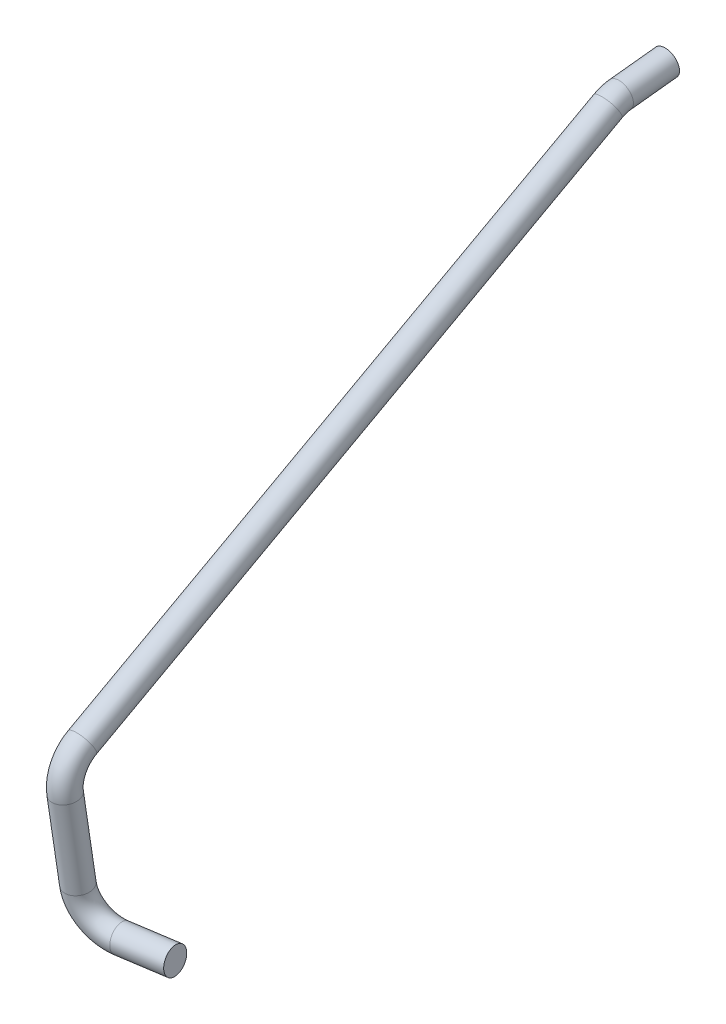
ISO-10303-21;
HEADER;
FILE_DESCRIPTION(('STEP AP214'),'2;1');
FILE_NAME('part.step','',(''),(''),'','','');
FILE_SCHEMA(('AUTOMOTIVE_DESIGN { 1 0 10303 214 1 1 1 1 }'));
ENDSEC;
DATA;
#1=APPLICATION_CONTEXT('core data for automotive mechanical design processes');
#2=APPLICATION_PROTOCOL_DEFINITION('international standard','automotive_design',2000,#1);
#3=PRODUCT_CONTEXT('',#1,'mechanical');
#4=PRODUCT('Part','Part','',(#3));
#5=PRODUCT_RELATED_PRODUCT_CATEGORY('part','',(#4));
#6=PRODUCT_DEFINITION_FORMATION('','',#4);
#7=PRODUCT_DEFINITION_CONTEXT('part definition',#1,'design');
#8=PRODUCT_DEFINITION('design','',#6,#7);
#9=PRODUCT_DEFINITION_SHAPE('','',#8);
#10=(LENGTH_UNIT() NAMED_UNIT(*) SI_UNIT(.MILLI.,.METRE.));
#11=(NAMED_UNIT(*) PLANE_ANGLE_UNIT() SI_UNIT($,.RADIAN.));
#12=(NAMED_UNIT(*) SI_UNIT($,.STERADIAN.) SOLID_ANGLE_UNIT());
#13=UNCERTAINTY_MEASURE_WITH_UNIT(LENGTH_MEASURE(1.E-05),#10,'distance_accuracy_value','');
#14=(GEOMETRIC_REPRESENTATION_CONTEXT(3) GLOBAL_UNCERTAINTY_ASSIGNED_CONTEXT((#13)) GLOBAL_UNIT_ASSIGNED_CONTEXT((#10,
#11,#12)) REPRESENTATION_CONTEXT('',''));
#15=CARTESIAN_POINT('',(0.,0.,0.));
#16=DIRECTION('',(0.,0.,1.));
#17=DIRECTION('',(1.,0.,0.));
#18=AXIS2_PLACEMENT_3D('',#15,#16,#17);
#19=CARTESIAN_POINT('',(-14.7000000000002,0.019999999999909,-8.00000000000085));
#20=DIRECTION('',(0.,0.109108389770973,-0.994029858345103));
#21=DIRECTION('',(0.210763812606863,0.971700980344327,0.106657489625867));
#22=AXIS2_PLACEMENT_3D('',#19,#20,#21);
#23=PLANE('',#22);
#24=CARTESIAN_POINT('',(-14.7000000000002,0.019999999999909,-8.00000000000085));
#25=DIRECTION('',(0.,0.109108389770973,-0.994029858345103));
#26=DIRECTION('',(0.210763812606863,0.971700980344327,0.106657489625867));
#27=AXIS2_PLACEMENT_3D('',#24,#25,#26);
#28=CIRCLE('',#27,7.49999999999998);
#29=CARTESIAN_POINT('',(-13.1192714054487,7.30775735258234,-7.20006882780685));
#30=VERTEX_POINT('',#29);
#31=EDGE_CURVE('E71',#30,#30,#28,.T.);
#32=ORIENTED_EDGE('',*,*,#31,.T.);
#33=EDGE_LOOP('',(#32));
#34=FACE_BOUND('',#33,.T.);
#35=ADVANCED_FACE('F43',(#34),#23,.T.);
#36=CARTESIAN_POINT('',(37.8047820171271,-254.9812713231,328.141635029711));
#37=DIRECTION('',(-0.993425252619403,-0.0394031681872077,0.107487942555832));
#38=DIRECTION('',(0.107571483257148,0.,0.994197352636717));
#39=AXIS2_PLACEMENT_3D('',#36,#37,#38);
#40=PLANE('',#39);
#41=CARTESIAN_POINT('',(37.8047820171271,-254.9812713231,328.141635029711));
#42=DIRECTION('',(-0.993425252619403,-0.0394031681872077,0.107487942555832));
#43=DIRECTION('',(0.107571483257148,0.,0.994197352636717));
#44=AXIS2_PLACEMENT_3D('',#41,#42,#43);
#45=CIRCLE('',#44,7.49999999999998);
#46=CARTESIAN_POINT('',(38.6115681415557,-254.9812713231,335.598115174486));
#47=VERTEX_POINT('',#46);
#48=EDGE_CURVE('E11',#47,#47,#45,.T.);
#49=ORIENTED_EDGE('',*,*,#48,.F.);
#50=EDGE_LOOP('',(#49));
#51=FACE_BOUND('',#50,.T.);
#52=ADVANCED_FACE('F79',(#51),#40,.F.);
#53=CARTESIAN_POINT('',(-14.7000000000002,0.019999999999909,-8.00000000000085));
#54=DIRECTION('',(0.,-0.109108389770971,0.994029858345103));
#55=DIRECTION('',(0.,-0.994029858345103,-0.109108389770971));
#56=AXIS2_PLACEMENT_3D('',#53,#54,#55);
#57=CYLINDRICAL_SURFACE('',#56,7.49999999999998);
#58=CARTESIAN_POINT('',(-14.7000000000002,-2.90175957283328,18.6186336394314));
#59=DIRECTION('',(0.,0.109108389770973,-0.994029858345103));
#60=DIRECTION('',(0.210763812606863,0.971700980344327,0.106657489625867));
#61=AXIS2_PLACEMENT_3D('',#58,#59,#60);
#62=CIRCLE('',#61,7.49999999999998);
#63=CARTESIAN_POINT('',(-14.8376233052832,4.55220911917241,19.4368087823209));
#64=VERTEX_POINT('',#63);
#65=EDGE_CURVE('E68',#64,#64,#62,.T.);
#66=ORIENTED_EDGE('',*,*,#65,.T.);
#67=EDGE_LOOP('',(#66));
#68=FACE_BOUND('',#67,.T.);
#69=ORIENTED_EDGE('',*,*,#31,.F.);
#70=EDGE_LOOP('',(#69));
#71=FACE_BOUND('',#70,.T.);
#72=ADVANCED_FACE('F76',(#68,#71),#57,.T.);
#73=CARTESIAN_POINT('',(-14.3330045192454,-22.7790094181817,16.4368332583926));
#74=DIRECTION('',(0.999831628721938,0.018240223287392,0.00200211429791808));
#75=DIRECTION('',(-0.0182402598451198,0.999833632621339,0.));
#76=AXIS2_PLACEMENT_3D('',#73,#74,#75);
#77=TOROIDAL_SURFACE('',#76,20.0000000000001,7.49999999999998);
#78=CARTESIAN_POINT('',(-14.6734304791778,-5.15601006023236,25.8874419052219));
#79=DIRECTION('',(-0.00685489764666,0.472484950372734,-0.881312079827305));
#80=DIRECTION('',(0.212057090618546,0.86197477912011,0.460468533647236));
#81=AXIS2_PLACEMENT_3D('',#78,#79,#80);
#82=CIRCLE('',#81,7.49999999999998);
#83=CARTESIAN_POINT('',(-14.8010902141525,1.45261469899859,29.4314201477828));
#84=VERTEX_POINT('',#83);
#85=EDGE_CURVE('E65',#84,#84,#82,.T.);
#86=CARTESIAN_POINT('',(-14.3330045192454,-22.7790094181817,16.4368332583926));
#87=DIRECTION('',(0.999831628721938,0.018240223287392,0.00200211429791808));
#88=DIRECTION('',(-0.0182402598451198,0.999833632621339,0.));
#89=AXIS2_PLACEMENT_3D('',#86,#87,#88);
#90=CIRCLE('',#89,27.5);
#91=EDGE_CURVE('',#64,#84,#90,.T.);
#92=ORIENTED_EDGE('',*,*,#65,.F.);
#93=ORIENTED_EDGE('',*,*,#85,.T.);
#94=ORIENTED_EDGE('',*,*,#91,.T.);
#95=ORIENTED_EDGE('',*,*,#91,.F.);
#96=EDGE_LOOP('',(#92,#94,#93,#95));
#97=FACE_BOUND('',#96,.T.);
#98=ADVANCED_FACE('F78',(#97),#77,.T.);
#99=CARTESIAN_POINT('',(-14.6734304791778,-5.15601006023247,25.8874419052219));
#100=DIRECTION('',(0.00685489764665841,-0.472484950372732,0.881312079827305));
#101=DIRECTION('',(0.,-0.881332786817704,-0.472496051708519));
#102=AXIS2_PLACEMENT_3D('',#99,#100,#101);
#103=CYLINDRICAL_SURFACE('',#102,7.49999999999998);
#104=CARTESIAN_POINT('',(-12.2954779904172,-169.060246353017,331.613123253899));
#105=DIRECTION('',(-0.0068548976466599,0.472484950372734,-0.881312079827305));
#106=DIRECTION('',(0.212057090618546,0.86197477912011,0.460468533647236));
#107=AXIS2_PLACEMENT_3D('',#104,#105,#106);
#108=CIRCLE('',#107,7.49999999999998);
#109=CARTESIAN_POINT('',(-12.4788549819553,-162.452820574992,335.156892076336));
#110=VERTEX_POINT('',#109);
#111=EDGE_CURVE('E62',#110,#110,#108,.T.);
#112=ORIENTED_EDGE('',*,*,#111,.T.);
#113=EDGE_LOOP('',(#112));
#114=FACE_BOUND('',#113,.T.);
#115=ORIENTED_EDGE('',*,*,#85,.F.);
#116=EDGE_LOOP('',(#115));
#117=FACE_BOUND('',#116,.T.);
#118=ADVANCED_FACE('F86',(#114,#117),#103,.T.);
#119=CARTESIAN_POINT('',(-11.8064726796492,-186.680048427748,322.163073060734));
#120=DIRECTION('',(0.999677545458212,0.0247872707154761,0.00551328551068042));
#121=DIRECTION('',(-0.0247876474449352,0.999692739062431,0.));
#122=AXIS2_PLACEMENT_3D('',#119,#120,#121);
#123=TOROIDAL_SURFACE('',#122,20.0000000000001,7.49999999999998);
#124=CARTESIAN_POINT('',(-11.8527979616586,-189.224070885855,342.000557873605));
#125=DIRECTION('',(-0.025287151426397,0.991567176515084,0.127102692460245));
#126=DIRECTION('',(0.233566446977962,-0.117764218055152,0.965183041599856));
#127=AXIS2_PLACEMENT_3D('',#124,#125,#126);
#128=CIRCLE('',#127,7.49999999999998);
#129=CARTESIAN_POINT('',(-11.8701699424121,-190.178079307645,349.439614678432));
#130=VERTEX_POINT('',#129);
#131=EDGE_CURVE('E57',#130,#130,#128,.T.);
#132=CARTESIAN_POINT('',(-11.8064726796492,-186.680048427748,322.163073060734));
#133=DIRECTION('',(0.999677545458212,0.0247872707154761,0.00551328551068042));
#134=DIRECTION('',(-0.0247876474449352,0.999692739062431,0.));
#135=AXIS2_PLACEMENT_3D('',#132,#133,#134);
#136=CIRCLE('',#135,27.5000000000001);
#137=EDGE_CURVE('',#110,#130,#136,.T.);
#138=ORIENTED_EDGE('',*,*,#111,.F.);
#139=ORIENTED_EDGE('',*,*,#131,.T.);
#140=ORIENTED_EDGE('',*,*,#137,.T.);
#141=ORIENTED_EDGE('',*,*,#137,.F.);
#142=EDGE_LOOP('',(#138,#140,#139,#141));
#143=FACE_BOUND('',#142,.T.);
#144=ADVANCED_FACE('F103',(#143),#123,.T.);
#145=CARTESIAN_POINT('',(-11.8527979616585,-189.224070885855,342.000557873606));
#146=DIRECTION('',(0.0252871514263958,-0.991567176515084,-0.127102692460244));
#147=DIRECTION('',(0.,0.127143349234026,-0.991884352505651));
#148=AXIS2_PLACEMENT_3D('',#145,#146,#147);
#149=CYLINDRICAL_SURFACE('',#148,7.49999999999998);
#150=CARTESIAN_POINT('',(-10.633248683198,-237.045393828612,335.870646510063));
#151=DIRECTION('',(-0.0252871514263972,0.991567176515084,0.127102692460247));
#152=DIRECTION('',(0.233566446977962,-0.117764218055153,0.965183041599856));
#153=AXIS2_PLACEMENT_3D('',#150,#151,#152);
#154=CIRCLE('',#153,7.49999999999998);
#155=CARTESIAN_POINT('',(-18.0839930045035,-237.338775917287,336.677080641644));
#156=VERTEX_POINT('',#155);
#157=EDGE_CURVE('E53',#156,#156,#154,.T.);
#158=ORIENTED_EDGE('',*,*,#157,.T.);
#159=EDGE_LOOP('',(#158));
#160=FACE_BOUND('',#159,.T.);
#161=ORIENTED_EDGE('',*,*,#131,.F.);
#162=EDGE_LOOP('',(#161));
#163=FACE_BOUND('',#162,.T.);
#164=ADVANCED_FACE('F97',(#160,#163),#149,.T.);
#165=CARTESIAN_POINT('',(9.23540284028328,-236.263041592144,333.720155492514));
#166=DIRECTION('',(0.111589769104977,-0.123548965609347,0.986044307588639));
#167=DIRECTION('',(0.,-0.992241493037678,-0.124325457949524));
#168=AXIS2_PLACEMENT_3D('',#165,#166,#167);
#169=TOROIDAL_SURFACE('',#168,20.0000000000001,7.49999999999998);
#170=CARTESIAN_POINT('',(9.74686775175654,-256.094158993175,331.177482436287));
#171=DIRECTION('',(-0.993425252619403,-0.0394031681872077,0.107487942555832));
#172=DIRECTION('',(0.107571483257148,0.,0.994197352636717));
#173=AXIS2_PLACEMENT_3D('',#170,#171,#172);
#174=CIRCLE('',#173,7.49999999999998);
#175=CARTESIAN_POINT('',(9.93866709355901,-263.530828018561,330.223980040202));
#176=VERTEX_POINT('',#175);
#177=EDGE_CURVE('E49',#176,#176,#174,.T.);
#178=CARTESIAN_POINT('',(9.23540284028328,-236.263041592144,333.720155492514));
#179=DIRECTION('',(0.111589769104977,-0.123548965609347,0.986044307588639));
#180=DIRECTION('',(0.,-0.992241493037678,-0.124325457949524));
#181=AXIS2_PLACEMENT_3D('',#178,#179,#180);
#182=CIRCLE('',#181,27.5000000000001);
#183=EDGE_CURVE('',#156,#176,#182,.T.);
#184=ORIENTED_EDGE('',*,*,#157,.F.);
#185=ORIENTED_EDGE('',*,*,#177,.T.);
#186=ORIENTED_EDGE('',*,*,#183,.T.);
#187=ORIENTED_EDGE('',*,*,#183,.F.);
#188=EDGE_LOOP('',(#184,#186,#185,#187));
#189=FACE_BOUND('',#188,.T.);
#190=ADVANCED_FACE('F92',(#189),#169,.T.);
#191=CARTESIAN_POINT('',(9.74686775175738,-256.094158993175,331.177482436287));
#192=DIRECTION('',(0.993425252619403,0.0394031681872057,-0.10748794255583));
#193=DIRECTION('',(-0.107571483257146,0.,-0.994197352636718));
#194=AXIS2_PLACEMENT_3D('',#191,#192,#193);
#195=CYLINDRICAL_SURFACE('',#194,7.49999999999998);
#196=ORIENTED_EDGE('',*,*,#48,.T.);
#197=EDGE_LOOP('',(#196));
#198=FACE_BOUND('',#197,.T.);
#199=ORIENTED_EDGE('',*,*,#177,.F.);
#200=EDGE_LOOP('',(#199));
#201=FACE_BOUND('',#200,.T.);
#202=ADVANCED_FACE('F90',(#198,#201),#195,.T.);
#203=CLOSED_SHELL('',(#35,#52,#72,#98,#118,#144,#164,#190,#202));
#204=MANIFOLD_SOLID_BREP('B2',#203);
#205=ADVANCED_BREP_SHAPE_REPRESENTATION('',(#18,#204),#14);
#206=SHAPE_DEFINITION_REPRESENTATION(#9,#205);
ENDSEC;
END-ISO-10303-21;
